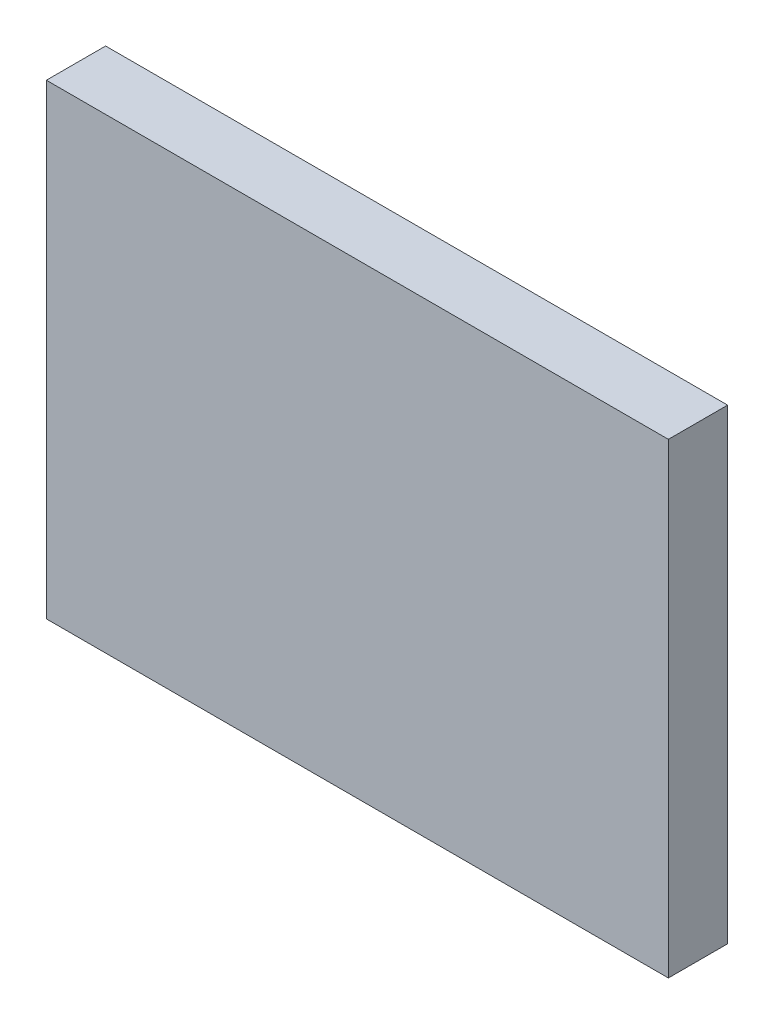
ISO-10303-21;
HEADER;
FILE_DESCRIPTION(('STEP AP214'),'2;1');
FILE_NAME('part.step','',(''),(''),'','','');
FILE_SCHEMA(('AUTOMOTIVE_DESIGN { 1 0 10303 214 1 1 1 1 }'));
ENDSEC;
DATA;
#1=APPLICATION_CONTEXT('core data for automotive mechanical design processes');
#2=APPLICATION_PROTOCOL_DEFINITION('international standard','automotive_design',2000,#1);
#3=PRODUCT_CONTEXT('',#1,'mechanical');
#4=PRODUCT('Part','Part','',(#3));
#5=PRODUCT_RELATED_PRODUCT_CATEGORY('part','',(#4));
#6=PRODUCT_DEFINITION_FORMATION('','',#4);
#7=PRODUCT_DEFINITION_CONTEXT('part definition',#1,'design');
#8=PRODUCT_DEFINITION('design','',#6,#7);
#9=PRODUCT_DEFINITION_SHAPE('','',#8);
#10=(LENGTH_UNIT() NAMED_UNIT(*) SI_UNIT(.MILLI.,.METRE.));
#11=(NAMED_UNIT(*) PLANE_ANGLE_UNIT() SI_UNIT($,.RADIAN.));
#12=(NAMED_UNIT(*) SI_UNIT($,.STERADIAN.) SOLID_ANGLE_UNIT());
#13=UNCERTAINTY_MEASURE_WITH_UNIT(LENGTH_MEASURE(1.E-05),#10,'distance_accuracy_value','');
#14=(GEOMETRIC_REPRESENTATION_CONTEXT(3) GLOBAL_UNCERTAINTY_ASSIGNED_CONTEXT((#13)) GLOBAL_UNIT_ASSIGNED_CONTEXT((#10,
#11,#12)) REPRESENTATION_CONTEXT('',''));
#15=CARTESIAN_POINT('',(0.,0.,0.));
#16=DIRECTION('',(0.,0.,1.));
#17=DIRECTION('',(1.,0.,0.));
#18=AXIS2_PLACEMENT_3D('',#15,#16,#17);
#19=CARTESIAN_POINT('',(-4.,-3.,0.762001524003));
#20=DIRECTION('',(0.,0.,1.));
#21=DIRECTION('',(1.,0.,0.));
#22=AXIS2_PLACEMENT_3D('',#19,#20,#21);
#23=PLANE('',#22);
#24=DIRECTION('',(0.,-1.,0.));
#25=VECTOR('',#24,1.);
#26=CARTESIAN_POINT('',(4.,0.,0.762001524003));
#27=LINE('',#26,#25);
#28=CARTESIAN_POINT('',(4.,3.,0.762001524003));
#29=VERTEX_POINT('',#28);
#30=CARTESIAN_POINT('',(4.,-3.,0.762001524003));
#31=VERTEX_POINT('',#30);
#32=EDGE_CURVE('E77',#29,#31,#27,.T.);
#33=ORIENTED_EDGE('',*,*,#32,.F.);
#34=DIRECTION('',(1.,0.,0.));
#35=VECTOR('',#34,1.);
#36=CARTESIAN_POINT('',(0.,3.,0.762001524003));
#37=LINE('',#36,#35);
#38=CARTESIAN_POINT('',(-4.,3.,0.762001524003));
#39=VERTEX_POINT('',#38);
#40=EDGE_CURVE('E59',#39,#29,#37,.T.);
#41=ORIENTED_EDGE('',*,*,#40,.F.);
#42=DIRECTION('',(0.,-1.,0.));
#43=VECTOR('',#42,1.);
#44=CARTESIAN_POINT('',(-4.,0.,0.762001524003));
#45=LINE('',#44,#43);
#46=CARTESIAN_POINT('',(-4.,-3.,0.762001524003));
#47=VERTEX_POINT('',#46);
#48=EDGE_CURVE('E21',#39,#47,#45,.T.);
#49=ORIENTED_EDGE('',*,*,#48,.T.);
#50=DIRECTION('',(1.,0.,0.));
#51=VECTOR('',#50,1.);
#52=CARTESIAN_POINT('',(0.,-3.,0.762001524003));
#53=LINE('',#52,#51);
#54=EDGE_CURVE('E56',#47,#31,#53,.T.);
#55=ORIENTED_EDGE('',*,*,#54,.T.);
#56=EDGE_LOOP('',(#33,#41,#49,#55));
#57=FACE_BOUND('',#56,.T.);
#58=ADVANCED_FACE('F17',(#57),#23,.T.);
#59=CARTESIAN_POINT('',(-4.,3.,0.));
#60=DIRECTION('',(1.,0.,0.));
#61=DIRECTION('',(0.,0.,1.));
#62=AXIS2_PLACEMENT_3D('',#59,#60,#61);
#63=PLANE('',#62);
#64=DIRECTION('',(0.,0.,1.));
#65=VECTOR('',#64,1.);
#66=CARTESIAN_POINT('',(-4.,3.,0.3810007620015));
#67=LINE('',#66,#65);
#68=CARTESIAN_POINT('',(-4.,3.,0.));
#69=VERTEX_POINT('',#68);
#70=EDGE_CURVE('E79',#69,#39,#67,.T.);
#71=ORIENTED_EDGE('',*,*,#70,.F.);
#72=DIRECTION('',(0.,-1.,0.));
#73=VECTOR('',#72,1.);
#74=CARTESIAN_POINT('',(-4.,0.,0.));
#75=LINE('',#74,#73);
#76=CARTESIAN_POINT('',(-4.,-3.,0.));
#77=VERTEX_POINT('',#76);
#78=EDGE_CURVE('E74',#69,#77,#75,.T.);
#79=ORIENTED_EDGE('',*,*,#78,.T.);
#80=DIRECTION('',(0.,0.,1.));
#81=VECTOR('',#80,1.);
#82=CARTESIAN_POINT('',(-4.,-3.,0.3810007620015));
#83=LINE('',#82,#81);
#84=EDGE_CURVE('E64',#77,#47,#83,.T.);
#85=ORIENTED_EDGE('',*,*,#84,.T.);
#86=ORIENTED_EDGE('',*,*,#48,.F.);
#87=EDGE_LOOP('',(#71,#79,#85,#86));
#88=FACE_BOUND('',#87,.T.);
#89=ADVANCED_FACE('F73',(#88),#63,.F.);
#90=CARTESIAN_POINT('',(-4.,-3.,0.));
#91=DIRECTION('',(0.,1.,0.));
#92=DIRECTION('',(0.,0.,1.));
#93=AXIS2_PLACEMENT_3D('',#90,#91,#92);
#94=PLANE('',#93);
#95=ORIENTED_EDGE('',*,*,#54,.F.);
#96=ORIENTED_EDGE('',*,*,#84,.F.);
#97=DIRECTION('',(1.,0.,0.));
#98=VECTOR('',#97,1.);
#99=CARTESIAN_POINT('',(0.,-3.,0.));
#100=LINE('',#99,#98);
#101=CARTESIAN_POINT('',(4.,-3.,0.));
#102=VERTEX_POINT('',#101);
#103=EDGE_CURVE('E84',#77,#102,#100,.T.);
#104=ORIENTED_EDGE('',*,*,#103,.T.);
#105=DIRECTION('',(0.,0.,-1.));
#106=VECTOR('',#105,1.);
#107=CARTESIAN_POINT('',(4.,-3.,0.3810007620015));
#108=LINE('',#107,#106);
#109=EDGE_CURVE('E70',#31,#102,#108,.T.);
#110=ORIENTED_EDGE('',*,*,#109,.F.);
#111=EDGE_LOOP('',(#95,#96,#104,#110));
#112=FACE_BOUND('',#111,.T.);
#113=ADVANCED_FACE('F67',(#112),#94,.F.);
#114=CARTESIAN_POINT('',(4.,3.,0.));
#115=DIRECTION('',(1.,0.,0.));
#116=DIRECTION('',(0.,0.,1.));
#117=AXIS2_PLACEMENT_3D('',#114,#115,#116);
#118=PLANE('',#117);
#119=DIRECTION('',(0.,0.,-1.));
#120=VECTOR('',#119,1.);
#121=CARTESIAN_POINT('',(4.,3.,0.3810007620015));
#122=LINE('',#121,#120);
#123=CARTESIAN_POINT('',(4.,3.,0.));
#124=VERTEX_POINT('',#123);
#125=EDGE_CURVE('E35',#29,#124,#122,.T.);
#126=ORIENTED_EDGE('',*,*,#125,.F.);
#127=ORIENTED_EDGE('',*,*,#32,.T.);
#128=ORIENTED_EDGE('',*,*,#109,.T.);
#129=DIRECTION('',(0.,1.,0.));
#130=VECTOR('',#129,1.);
#131=CARTESIAN_POINT('',(4.,0.,0.));
#132=LINE('',#131,#130);
#133=EDGE_CURVE('E27',#102,#124,#132,.T.);
#134=ORIENTED_EDGE('',*,*,#133,.T.);
#135=EDGE_LOOP('',(#126,#127,#128,#134));
#136=FACE_BOUND('',#135,.T.);
#137=ADVANCED_FACE('F89',(#136),#118,.T.);
#138=CARTESIAN_POINT('',(-4.,3.,0.));
#139=DIRECTION('',(0.,1.,0.));
#140=DIRECTION('',(0.,0.,1.));
#141=AXIS2_PLACEMENT_3D('',#138,#139,#140);
#142=PLANE('',#141);
#143=ORIENTED_EDGE('',*,*,#40,.T.);
#144=ORIENTED_EDGE('',*,*,#125,.T.);
#145=DIRECTION('',(-1.,0.,0.));
#146=VECTOR('',#145,1.);
#147=CARTESIAN_POINT('',(0.,3.,0.));
#148=LINE('',#147,#146);
#149=EDGE_CURVE('E11',#124,#69,#148,.T.);
#150=ORIENTED_EDGE('',*,*,#149,.T.);
#151=ORIENTED_EDGE('',*,*,#70,.T.);
#152=EDGE_LOOP('',(#143,#144,#150,#151));
#153=FACE_BOUND('',#152,.T.);
#154=ADVANCED_FACE('F91',(#153),#142,.T.);
#155=CARTESIAN_POINT('',(-4.,-3.,0.));
#156=DIRECTION('',(0.,0.,1.));
#157=DIRECTION('',(1.,0.,0.));
#158=AXIS2_PLACEMENT_3D('',#155,#156,#157);
#159=PLANE('',#158);
#160=ORIENTED_EDGE('',*,*,#133,.F.);
#161=ORIENTED_EDGE('',*,*,#103,.F.);
#162=ORIENTED_EDGE('',*,*,#78,.F.);
#163=ORIENTED_EDGE('',*,*,#149,.F.);
#164=EDGE_LOOP('',(#160,#161,#162,#163));
#165=FACE_BOUND('',#164,.T.);
#166=ADVANCED_FACE('F19',(#165),#159,.F.);
#167=CLOSED_SHELL('',(#58,#89,#113,#137,#154,#166));
#168=MANIFOLD_SOLID_BREP('B1',#167);
#169=ADVANCED_BREP_SHAPE_REPRESENTATION('',(#18,#168),#14);
#170=SHAPE_DEFINITION_REPRESENTATION(#9,#169);
ENDSEC;
END-ISO-10303-21;
